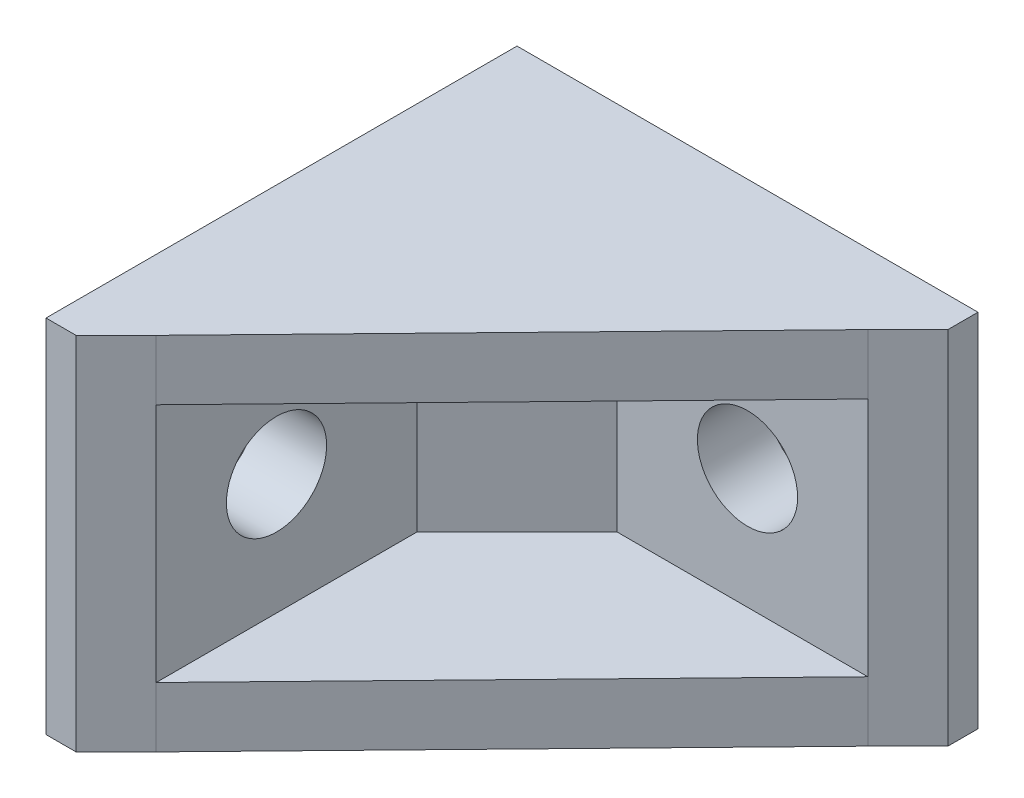
ISO-10303-21;
HEADER;
FILE_DESCRIPTION(('STEP AP214'),'2;1');
FILE_NAME('part.step','',(''),(''),'','','');
FILE_SCHEMA(('AUTOMOTIVE_DESIGN { 1 0 10303 214 1 1 1 1 }'));
ENDSEC;
DATA;
#1=APPLICATION_CONTEXT('core data for automotive mechanical design processes');
#2=APPLICATION_PROTOCOL_DEFINITION('international standard','automotive_design',2000,#1);
#3=PRODUCT_CONTEXT('',#1,'mechanical');
#4=PRODUCT('Part','Part','',(#3));
#5=PRODUCT_RELATED_PRODUCT_CATEGORY('part','',(#4));
#6=PRODUCT_DEFINITION_FORMATION('','',#4);
#7=PRODUCT_DEFINITION_CONTEXT('part definition',#1,'design');
#8=PRODUCT_DEFINITION('design','',#6,#7);
#9=PRODUCT_DEFINITION_SHAPE('','',#8);
#10=(LENGTH_UNIT() NAMED_UNIT(*) SI_UNIT(.MILLI.,.METRE.));
#11=(NAMED_UNIT(*) PLANE_ANGLE_UNIT() SI_UNIT($,.RADIAN.));
#12=(NAMED_UNIT(*) SI_UNIT($,.STERADIAN.) SOLID_ANGLE_UNIT());
#13=UNCERTAINTY_MEASURE_WITH_UNIT(LENGTH_MEASURE(1.E-05),#10,'distance_accuracy_value','');
#14=(GEOMETRIC_REPRESENTATION_CONTEXT(3) GLOBAL_UNCERTAINTY_ASSIGNED_CONTEXT((#13)) GLOBAL_UNIT_ASSIGNED_CONTEXT((#10,
#11,#12)) REPRESENTATION_CONTEXT('',''));
#15=CARTESIAN_POINT('',(0.,0.,0.));
#16=DIRECTION('',(0.,0.,1.));
#17=DIRECTION('',(1.,0.,0.));
#18=AXIS2_PLACEMENT_3D('',#15,#16,#17);
#19=CARTESIAN_POINT('',(0.,0.,3.5));
#20=DIRECTION('',(0.,0.,1.));
#21=DIRECTION('',(1.,0.,0.));
#22=AXIS2_PLACEMENT_3D('',#19,#20,#21);
#23=PLANE('',#22);
#24=CARTESIAN_POINT('',(4.33614349775784,5.76000000000001,3.5));
#25=DIRECTION('',(0.,0.,1.));
#26=DIRECTION('',(1.,0.,0.));
#27=AXIS2_PLACEMENT_3D('',#24,#25,#26);
#28=CIRCLE('',#27,2.5);
#29=CARTESIAN_POINT('',(6.83614349775784,5.76000000000001,3.5));
#30=VERTEX_POINT('',#29);
#31=EDGE_CURVE('E166',#30,#30,#28,.T.);
#32=ORIENTED_EDGE('',*,*,#31,.F.);
#33=EDGE_LOOP('',(#32));
#34=FACE_BOUND('',#33,.T.);
#35=DIRECTION('',(0.,-1.,0.));
#36=VECTOR('',#35,1.);
#37=CARTESIAN_POINT('',(-2.16385650224218,0.,3.5));
#38=LINE('',#37,#36);
#39=CARTESIAN_POINT('',(-2.16385650224218,11.76,3.5));
#40=VERTEX_POINT('',#39);
#41=CARTESIAN_POINT('',(-2.16385650224218,-0.239999999999996,3.5));
#42=VERTEX_POINT('',#41);
#43=EDGE_CURVE('E128',#40,#42,#38,.T.);
#44=ORIENTED_EDGE('',*,*,#43,.T.);
#45=DIRECTION('',(1.,0.,0.));
#46=VECTOR('',#45,1.);
#47=CARTESIAN_POINT('',(10.3361434977578,-0.239999999999996,3.5));
#48=LINE('',#47,#46);
#49=CARTESIAN_POINT('',(10.3361434977578,-0.239999999999996,3.5));
#50=VERTEX_POINT('',#49);
#51=EDGE_CURVE('E127',#42,#50,#48,.T.);
#52=ORIENTED_EDGE('',*,*,#51,.T.);
#53=DIRECTION('',(0.,1.,0.));
#54=VECTOR('',#53,1.);
#55=CARTESIAN_POINT('',(10.3361434977578,14.76,3.5));
#56=LINE('',#55,#54);
#57=CARTESIAN_POINT('',(10.3361434977578,11.76,3.5));
#58=VERTEX_POINT('',#57);
#59=EDGE_CURVE('E116',#50,#58,#56,.T.);
#60=ORIENTED_EDGE('',*,*,#59,.T.);
#61=DIRECTION('',(-1.,0.,0.));
#62=VECTOR('',#61,1.);
#63=CARTESIAN_POINT('',(-2.16385650224218,11.76,3.5));
#64=LINE('',#63,#62);
#65=EDGE_CURVE('E147',#58,#40,#64,.T.);
#66=ORIENTED_EDGE('',*,*,#65,.T.);
#67=EDGE_LOOP('',(#44,#52,#60,#66));
#68=FACE_BOUND('',#67,.T.);
#69=ADVANCED_FACE('F32',(#34,#68),#23,.T.);
#70=CARTESIAN_POINT('',(-7.16385650224216,-3.24,23.5));
#71=DIRECTION('',(-1.,0.,0.));
#72=DIRECTION('',(0.,-1.,0.));
#73=AXIS2_PLACEMENT_3D('',#70,#71,#72);
#74=PLANE('',#73);
#75=CARTESIAN_POINT('',(-7.16385650224216,5.76,15.5));
#76=DIRECTION('',(1.,0.,0.));
#77=DIRECTION('',(0.,1.,0.));
#78=AXIS2_PLACEMENT_3D('',#75,#76,#77);
#79=CIRCLE('',#78,2.5);
#80=CARTESIAN_POINT('',(-7.16385650224216,8.26,15.5));
#81=VERTEX_POINT('',#80);
#82=EDGE_CURVE('E160',#81,#81,#79,.T.);
#83=ORIENTED_EDGE('',*,*,#82,.F.);
#84=EDGE_LOOP('',(#83));
#85=FACE_BOUND('',#84,.T.);
#86=DIRECTION('',(0.,0.,-1.));
#87=VECTOR('',#86,1.);
#88=CARTESIAN_POINT('',(-7.16385650224216,-0.239999999999996,8.50000000000004));
#89=LINE('',#88,#87);
#90=CARTESIAN_POINT('',(-7.16385650224216,-0.239999999999996,21.5));
#91=VERTEX_POINT('',#90);
#92=CARTESIAN_POINT('',(-7.16385650224216,-0.239999999999996,8.50000000000004));
#93=VERTEX_POINT('',#92);
#94=EDGE_CURVE('E55',#91,#93,#89,.T.);
#95=ORIENTED_EDGE('',*,*,#94,.T.);
#96=DIRECTION('',(0.,1.,0.));
#97=VECTOR('',#96,1.);
#98=CARTESIAN_POINT('',(-7.16385650224216,-3.24,8.50000000000004));
#99=LINE('',#98,#97);
#100=CARTESIAN_POINT('',(-7.16385650224217,11.76,8.50000000000004));
#101=VERTEX_POINT('',#100);
#102=EDGE_CURVE('E199',#93,#101,#99,.T.);
#103=ORIENTED_EDGE('',*,*,#102,.T.);
#104=DIRECTION('',(0.,0.,1.));
#105=VECTOR('',#104,1.);
#106=CARTESIAN_POINT('',(-7.16385650224217,11.76,21.5));
#107=LINE('',#106,#105);
#108=CARTESIAN_POINT('',(-7.16385650224217,11.76,21.5));
#109=VERTEX_POINT('',#108);
#110=EDGE_CURVE('E152',#101,#109,#107,.T.);
#111=ORIENTED_EDGE('',*,*,#110,.T.);
#112=DIRECTION('',(0.,-1.,0.));
#113=VECTOR('',#112,1.);
#114=CARTESIAN_POINT('',(-7.16385650224216,-3.24,21.5));
#115=LINE('',#114,#113);
#116=EDGE_CURVE('E211',#109,#91,#115,.T.);
#117=ORIENTED_EDGE('',*,*,#116,.T.);
#118=EDGE_LOOP('',(#95,#103,#111,#117));
#119=FACE_BOUND('',#118,.T.);
#120=ADVANCED_FACE('F254',(#85,#119),#74,.F.);
#121=CARTESIAN_POINT('',(-7.16385650224216,-3.24,8.50000000000004));
#122=DIRECTION('',(-0.707106781186551,0.,-0.707106781186544));
#123=DIRECTION('',(0.,1.,0.));
#124=AXIS2_PLACEMENT_3D('',#121,#122,#123);
#125=PLANE('',#124);
#126=DIRECTION('',(0.707106781186544,0.,-0.707106781186551));
#127=VECTOR('',#126,1.);
#128=CARTESIAN_POINT('',(-2.16385650224217,-0.239999999999996,3.5));
#129=LINE('',#128,#127);
#130=EDGE_CURVE('E47',#93,#42,#129,.T.);
#131=ORIENTED_EDGE('',*,*,#130,.T.);
#132=ORIENTED_EDGE('',*,*,#43,.F.);
#133=DIRECTION('',(-0.707106781186544,0.,0.707106781186551));
#134=VECTOR('',#133,1.);
#135=CARTESIAN_POINT('',(-7.16385650224217,11.76,8.50000000000004));
#136=LINE('',#135,#134);
#137=EDGE_CURVE('E149',#40,#101,#136,.T.);
#138=ORIENTED_EDGE('',*,*,#137,.T.);
#139=ORIENTED_EDGE('',*,*,#102,.F.);
#140=EDGE_LOOP('',(#131,#132,#138,#139));
#141=FACE_BOUND('',#140,.T.);
#142=ADVANCED_FACE('F252',(#141),#125,.F.);
#143=CARTESIAN_POINT('',(-10.6638565022422,14.76,3.5));
#144=DIRECTION('',(1.,0.,0.));
#145=DIRECTION('',(0.,1.,0.));
#146=AXIS2_PLACEMENT_3D('',#143,#144,#145);
#147=PLANE('',#146);
#148=CARTESIAN_POINT('',(-10.6638565022422,5.76,15.5));
#149=DIRECTION('',(1.,0.,0.));
#150=DIRECTION('',(0.,1.,0.));
#151=AXIS2_PLACEMENT_3D('',#148,#149,#150);
#152=CIRCLE('',#151,2.5);
#153=CARTESIAN_POINT('',(-10.6638565022422,8.26,15.5));
#154=VERTEX_POINT('',#153);
#155=EDGE_CURVE('E163',#154,#154,#152,.T.);
#156=ORIENTED_EDGE('',*,*,#155,.T.);
#157=EDGE_LOOP('',(#156));
#158=FACE_BOUND('',#157,.T.);
#159=DIRECTION('',(0.,-1.,0.));
#160=VECTOR('',#159,1.);
#161=CARTESIAN_POINT('',(-10.6638565022422,14.76,0.));
#162=LINE('',#161,#160);
#163=CARTESIAN_POINT('',(-10.6638565022422,14.76,0.));
#164=VERTEX_POINT('',#163);
#165=CARTESIAN_POINT('',(-10.6638565022422,-3.24,0.));
#166=VERTEX_POINT('',#165);
#167=EDGE_CURVE('E178',#164,#166,#162,.T.);
#168=ORIENTED_EDGE('',*,*,#167,.T.);
#169=DIRECTION('',(0.,0.,-1.));
#170=VECTOR('',#169,1.);
#171=CARTESIAN_POINT('',(-10.6638565022422,-3.24,3.5));
#172=LINE('',#171,#170);
#173=CARTESIAN_POINT('',(-10.6638565022422,-3.24,23.5));
#174=VERTEX_POINT('',#173);
#175=EDGE_CURVE('E196',#174,#166,#172,.T.);
#176=ORIENTED_EDGE('',*,*,#175,.F.);
#177=DIRECTION('',(0.,-1.,0.));
#178=VECTOR('',#177,1.);
#179=CARTESIAN_POINT('',(-10.6638565022422,-3.24,23.5));
#180=LINE('',#179,#178);
#181=CARTESIAN_POINT('',(-10.6638565022422,14.76,23.5));
#182=VERTEX_POINT('',#181);
#183=EDGE_CURVE('E170',#182,#174,#180,.T.);
#184=ORIENTED_EDGE('',*,*,#183,.F.);
#185=DIRECTION('',(0.,0.,-1.));
#186=VECTOR('',#185,1.);
#187=CARTESIAN_POINT('',(-10.6638565022422,14.76,3.5));
#188=LINE('',#187,#186);
#189=EDGE_CURVE('E189',#182,#164,#188,.T.);
#190=ORIENTED_EDGE('',*,*,#189,.T.);
#191=EDGE_LOOP('',(#168,#176,#184,#190));
#192=FACE_BOUND('',#191,.T.);
#193=ADVANCED_FACE('F236',(#158,#192),#147,.F.);
#194=CARTESIAN_POINT('',(-10.6638565022422,-3.24,3.5));
#195=DIRECTION('',(0.,1.,0.));
#196=DIRECTION('',(0.,0.,1.));
#197=AXIS2_PLACEMENT_3D('',#194,#195,#196);
#198=PLANE('',#197);
#199=DIRECTION('',(-0.707106781186545,0.,0.70710678118655));
#200=VECTOR('',#199,1.);
#201=CARTESIAN_POINT('',(10.3361434977578,-3.24,3.5));
#202=LINE('',#201,#200);
#203=CARTESIAN_POINT('',(12.3361434977578,-3.24,1.49999999999999));
#204=VERTEX_POINT('',#203);
#205=CARTESIAN_POINT('',(10.3361434977578,-3.24,3.5));
#206=VERTEX_POINT('',#205);
#207=EDGE_CURVE('E215',#204,#206,#202,.T.);
#208=ORIENTED_EDGE('',*,*,#207,.T.);
#209=DIRECTION('',(-0.697078393291808,0.,0.71699491881443));
#210=VECTOR('',#209,1.);
#211=CARTESIAN_POINT('',(-7.16385650224216,-3.24,21.5));
#212=LINE('',#211,#210);
#213=CARTESIAN_POINT('',(-7.16385650224216,-3.24,21.5));
#214=VERTEX_POINT('',#213);
#215=EDGE_CURVE('E138',#206,#214,#212,.T.);
#216=ORIENTED_EDGE('',*,*,#215,.T.);
#217=DIRECTION('',(0.707106781186546,0.,-0.707106781186549));
#218=VECTOR('',#217,1.);
#219=CARTESIAN_POINT('',(-9.16385650224216,-3.24,23.5));
#220=LINE('',#219,#218);
#221=CARTESIAN_POINT('',(-9.16385650224216,-3.24,23.5));
#222=VERTEX_POINT('',#221);
#223=EDGE_CURVE('E125',#214,#222,#220,.F.);
#224=ORIENTED_EDGE('',*,*,#223,.T.);
#225=DIRECTION('',(1.,0.,0.));
#226=VECTOR('',#225,1.);
#227=CARTESIAN_POINT('',(-10.6638565022422,-3.24,23.5));
#228=LINE('',#227,#226);
#229=EDGE_CURVE('E173',#174,#222,#228,.T.);
#230=ORIENTED_EDGE('',*,*,#229,.F.);
#231=ORIENTED_EDGE('',*,*,#175,.T.);
#232=DIRECTION('',(1.,0.,0.));
#233=VECTOR('',#232,1.);
#234=CARTESIAN_POINT('',(-10.6638565022422,-3.24,0.));
#235=LINE('',#234,#233);
#236=CARTESIAN_POINT('',(12.3361434977578,-3.24,0.));
#237=VERTEX_POINT('',#236);
#238=EDGE_CURVE('E181',#166,#237,#235,.T.);
#239=ORIENTED_EDGE('',*,*,#238,.T.);
#240=DIRECTION('',(0.,0.,-1.));
#241=VECTOR('',#240,1.);
#242=CARTESIAN_POINT('',(12.3361434977578,-3.24,3.5));
#243=LINE('',#242,#241);
#244=EDGE_CURVE('E194',#204,#237,#243,.T.);
#245=ORIENTED_EDGE('',*,*,#244,.F.);
#246=EDGE_LOOP('',(#208,#216,#224,#230,#231,#239,#245));
#247=FACE_BOUND('',#246,.T.);
#248=ADVANCED_FACE('F219',(#247),#198,.F.);
#249=CARTESIAN_POINT('',(12.3361434977578,14.76,3.5));
#250=DIRECTION('',(-1.,0.,0.));
#251=DIRECTION('',(0.,-1.,0.));
#252=AXIS2_PLACEMENT_3D('',#249,#250,#251);
#253=PLANE('',#252);
#254=DIRECTION('',(0.,0.,-1.));
#255=VECTOR('',#254,1.);
#256=CARTESIAN_POINT('',(12.3361434977578,14.76,3.5));
#257=LINE('',#256,#255);
#258=CARTESIAN_POINT('',(12.3361434977578,14.76,1.49999999999999));
#259=VERTEX_POINT('',#258);
#260=CARTESIAN_POINT('',(12.3361434977578,14.76,0.));
#261=VERTEX_POINT('',#260);
#262=EDGE_CURVE('E192',#259,#261,#257,.T.);
#263=ORIENTED_EDGE('',*,*,#262,.F.);
#264=DIRECTION('',(0.,-1.,0.));
#265=VECTOR('',#264,1.);
#266=CARTESIAN_POINT('',(12.3361434977578,-3.24,1.49999999999999));
#267=LINE('',#266,#265);
#268=EDGE_CURVE('E11',#259,#204,#267,.T.);
#269=ORIENTED_EDGE('',*,*,#268,.T.);
#270=ORIENTED_EDGE('',*,*,#244,.T.);
#271=DIRECTION('',(0.,1.,0.));
#272=VECTOR('',#271,1.);
#273=CARTESIAN_POINT('',(12.3361434977578,14.76,0.));
#274=LINE('',#273,#272);
#275=EDGE_CURVE('E184',#237,#261,#274,.T.);
#276=ORIENTED_EDGE('',*,*,#275,.T.);
#277=EDGE_LOOP('',(#263,#269,#270,#276));
#278=FACE_BOUND('',#277,.T.);
#279=ADVANCED_FACE('F243',(#278),#253,.F.);
#280=CARTESIAN_POINT('',(-10.6638565022422,14.76,3.5));
#281=DIRECTION('',(0.,-1.,0.));
#282=DIRECTION('',(0.,0.,-1.));
#283=AXIS2_PLACEMENT_3D('',#280,#281,#282);
#284=PLANE('',#283);
#285=DIRECTION('',(-1.,0.,0.));
#286=VECTOR('',#285,1.);
#287=CARTESIAN_POINT('',(-10.6638565022422,14.76,23.5));
#288=LINE('',#287,#286);
#289=CARTESIAN_POINT('',(-9.16385650224217,14.76,23.5));
#290=VERTEX_POINT('',#289);
#291=EDGE_CURVE('E176',#290,#182,#288,.T.);
#292=ORIENTED_EDGE('',*,*,#291,.F.);
#293=DIRECTION('',(-0.707106781186546,0.,0.707106781186549));
#294=VECTOR('',#293,1.);
#295=CARTESIAN_POINT('',(-9.16385650224217,14.76,23.5));
#296=LINE('',#295,#294);
#297=CARTESIAN_POINT('',(-7.16385650224217,14.76,21.5));
#298=VERTEX_POINT('',#297);
#299=EDGE_CURVE('E209',#290,#298,#296,.F.);
#300=ORIENTED_EDGE('',*,*,#299,.T.);
#301=DIRECTION('',(0.697078393291808,0.,-0.71699491881443));
#302=VECTOR('',#301,1.);
#303=CARTESIAN_POINT('',(10.3361434977578,14.76,3.5));
#304=LINE('',#303,#302);
#305=CARTESIAN_POINT('',(10.3361434977578,14.76,3.5));
#306=VERTEX_POINT('',#305);
#307=EDGE_CURVE('E142',#298,#306,#304,.T.);
#308=ORIENTED_EDGE('',*,*,#307,.T.);
#309=DIRECTION('',(0.707106781186545,0.,-0.70710678118655));
#310=VECTOR('',#309,1.);
#311=CARTESIAN_POINT('',(10.3361434977578,14.76,3.5));
#312=LINE('',#311,#310);
#313=EDGE_CURVE('E207',#306,#259,#312,.T.);
#314=ORIENTED_EDGE('',*,*,#313,.T.);
#315=ORIENTED_EDGE('',*,*,#262,.T.);
#316=DIRECTION('',(-1.,0.,0.));
#317=VECTOR('',#316,1.);
#318=CARTESIAN_POINT('',(-10.6638565022422,14.76,0.));
#319=LINE('',#318,#317);
#320=EDGE_CURVE('E187',#261,#164,#319,.T.);
#321=ORIENTED_EDGE('',*,*,#320,.T.);
#322=ORIENTED_EDGE('',*,*,#189,.F.);
#323=EDGE_LOOP('',(#292,#300,#308,#314,#315,#321,#322));
#324=FACE_BOUND('',#323,.T.);
#325=ADVANCED_FACE('F231',(#324),#284,.F.);
#326=CARTESIAN_POINT('',(0.,0.,0.));
#327=DIRECTION('',(0.,0.,1.));
#328=DIRECTION('',(1.,0.,0.));
#329=AXIS2_PLACEMENT_3D('',#326,#327,#328);
#330=PLANE('',#329);
#331=CARTESIAN_POINT('',(4.33614349775784,5.76000000000001,0.));
#332=DIRECTION('',(0.,0.,1.));
#333=DIRECTION('',(1.,0.,0.));
#334=AXIS2_PLACEMENT_3D('',#331,#332,#333);
#335=CIRCLE('',#334,2.5);
#336=CARTESIAN_POINT('',(6.83614349775784,5.76000000000001,0.));
#337=VERTEX_POINT('',#336);
#338=EDGE_CURVE('E169',#337,#337,#335,.T.);
#339=ORIENTED_EDGE('',*,*,#338,.T.);
#340=EDGE_LOOP('',(#339));
#341=FACE_BOUND('',#340,.T.);
#342=ORIENTED_EDGE('',*,*,#167,.F.);
#343=ORIENTED_EDGE('',*,*,#320,.F.);
#344=ORIENTED_EDGE('',*,*,#275,.F.);
#345=ORIENTED_EDGE('',*,*,#238,.F.);
#346=EDGE_LOOP('',(#342,#343,#344,#345));
#347=FACE_BOUND('',#346,.T.);
#348=ADVANCED_FACE('F240',(#341,#347),#330,.F.);
#349=CARTESIAN_POINT('',(0.,0.,23.5));
#350=DIRECTION('',(0.,0.,-1.));
#351=DIRECTION('',(-1.,0.,0.));
#352=AXIS2_PLACEMENT_3D('',#349,#350,#351);
#353=PLANE('',#352);
#354=ORIENTED_EDGE('',*,*,#229,.T.);
#355=DIRECTION('',(0.,1.,0.));
#356=VECTOR('',#355,1.);
#357=CARTESIAN_POINT('',(-9.16385650224216,0.,23.5));
#358=LINE('',#357,#356);
#359=EDGE_CURVE('E204',#222,#290,#358,.T.);
#360=ORIENTED_EDGE('',*,*,#359,.T.);
#361=ORIENTED_EDGE('',*,*,#291,.T.);
#362=ORIENTED_EDGE('',*,*,#183,.T.);
#363=EDGE_LOOP('',(#354,#360,#361,#362));
#364=FACE_BOUND('',#363,.T.);
#365=ADVANCED_FACE('F223',(#364),#353,.F.);
#366=CARTESIAN_POINT('',(4.33614349775784,5.76000000000001,-16.5));
#367=DIRECTION('',(0.,0.,1.));
#368=DIRECTION('',(1.,0.,0.));
#369=AXIS2_PLACEMENT_3D('',#366,#367,#368);
#370=CYLINDRICAL_SURFACE('',#369,2.5);
#371=ORIENTED_EDGE('',*,*,#31,.T.);
#372=EDGE_LOOP('',(#371));
#373=FACE_BOUND('',#372,.T.);
#374=ORIENTED_EDGE('',*,*,#338,.F.);
#375=EDGE_LOOP('',(#374));
#376=FACE_BOUND('',#375,.T.);
#377=ADVANCED_FACE('F286',(#373,#376),#370,.F.);
#378=CARTESIAN_POINT('',(-27.1638565022422,5.76,15.5));
#379=DIRECTION('',(1.,0.,0.));
#380=DIRECTION('',(0.,1.,0.));
#381=AXIS2_PLACEMENT_3D('',#378,#379,#380);
#382=CYLINDRICAL_SURFACE('',#381,2.5);
#383=ORIENTED_EDGE('',*,*,#82,.T.);
#384=EDGE_LOOP('',(#383));
#385=FACE_BOUND('',#384,.T.);
#386=ORIENTED_EDGE('',*,*,#155,.F.);
#387=EDGE_LOOP('',(#386));
#388=FACE_BOUND('',#387,.T.);
#389=ADVANCED_FACE('F281',(#385,#388),#382,.F.);
#390=CARTESIAN_POINT('',(-9.16385650224216,0.,23.5));
#391=DIRECTION('',(-0.707106781186549,0.,-0.707106781186546));
#392=DIRECTION('',(0.,1.,0.));
#393=AXIS2_PLACEMENT_3D('',#390,#391,#392);
#394=PLANE('',#393);
#395=ORIENTED_EDGE('',*,*,#223,.F.);
#396=DIRECTION('',(0.,-1.,0.));
#397=VECTOR('',#396,1.);
#398=CARTESIAN_POINT('',(-7.16385650224216,-0.239999999999996,21.5));
#399=LINE('',#398,#397);
#400=EDGE_CURVE('E140',#91,#214,#399,.T.);
#401=ORIENTED_EDGE('',*,*,#400,.F.);
#402=ORIENTED_EDGE('',*,*,#116,.F.);
#403=EDGE_CURVE('E212',#298,#109,#115,.T.);
#404=ORIENTED_EDGE('',*,*,#403,.F.);
#405=ORIENTED_EDGE('',*,*,#299,.F.);
#406=ORIENTED_EDGE('',*,*,#359,.F.);
#407=EDGE_LOOP('',(#395,#401,#402,#404,#405,#406));
#408=FACE_BOUND('',#407,.T.);
#409=ADVANCED_FACE('F226',(#408),#394,.F.);
#410=CARTESIAN_POINT('',(10.3361434977578,0.,3.5));
#411=DIRECTION('',(0.70710678118655,0.,0.707106781186545));
#412=DIRECTION('',(0.,-1.,0.));
#413=AXIS2_PLACEMENT_3D('',#410,#411,#412);
#414=PLANE('',#413);
#415=ORIENTED_EDGE('',*,*,#207,.F.);
#416=ORIENTED_EDGE('',*,*,#268,.F.);
#417=ORIENTED_EDGE('',*,*,#313,.F.);
#418=DIRECTION('',(0.,1.,0.));
#419=VECTOR('',#418,1.);
#420=CARTESIAN_POINT('',(10.3361434977578,11.76,3.5));
#421=LINE('',#420,#419);
#422=EDGE_CURVE('E122',#58,#306,#421,.T.);
#423=ORIENTED_EDGE('',*,*,#422,.F.);
#424=ORIENTED_EDGE('',*,*,#59,.F.);
#425=EDGE_CURVE('E40',#206,#50,#56,.T.);
#426=ORIENTED_EDGE('',*,*,#425,.F.);
#427=EDGE_LOOP('',(#415,#416,#417,#423,#424,#426));
#428=FACE_BOUND('',#427,.T.);
#429=ADVANCED_FACE('F34',(#428),#414,.T.);
#430=CARTESIAN_POINT('',(10.3361434977578,11.76,3.5));
#431=DIRECTION('',(0.71699491881443,0.,0.697078393291808));
#432=DIRECTION('',(0.697078393291808,0.,-0.71699491881443));
#433=AXIS2_PLACEMENT_3D('',#430,#431,#432);
#434=PLANE('',#433);
#435=ORIENTED_EDGE('',*,*,#307,.F.);
#436=ORIENTED_EDGE('',*,*,#403,.T.);
#437=DIRECTION('',(0.697078393291808,0.,-0.71699491881443));
#438=VECTOR('',#437,1.);
#439=CARTESIAN_POINT('',(10.3361434977578,11.76,3.5));
#440=LINE('',#439,#438);
#441=EDGE_CURVE('E154',#109,#58,#440,.T.);
#442=ORIENTED_EDGE('',*,*,#441,.T.);
#443=ORIENTED_EDGE('',*,*,#422,.T.);
#444=EDGE_LOOP('',(#435,#436,#442,#443));
#445=FACE_BOUND('',#444,.T.);
#446=ADVANCED_FACE('F246',(#445),#434,.T.);
#447=CARTESIAN_POINT('',(0.,11.76,0.));
#448=DIRECTION('',(0.,1.,0.));
#449=DIRECTION('',(0.,0.,1.));
#450=AXIS2_PLACEMENT_3D('',#447,#448,#449);
#451=PLANE('',#450);
#452=ORIENTED_EDGE('',*,*,#65,.F.);
#453=ORIENTED_EDGE('',*,*,#441,.F.);
#454=ORIENTED_EDGE('',*,*,#110,.F.);
#455=ORIENTED_EDGE('',*,*,#137,.F.);
#456=EDGE_LOOP('',(#452,#453,#454,#455));
#457=FACE_BOUND('',#456,.T.);
#458=ADVANCED_FACE('F250',(#457),#451,.F.);
#459=CARTESIAN_POINT('',(-7.16385650224216,-0.239999999999996,21.5));
#460=DIRECTION('',(0.71699491881443,0.,0.697078393291808));
#461=DIRECTION('',(0.697078393291808,0.,-0.71699491881443));
#462=AXIS2_PLACEMENT_3D('',#459,#460,#461);
#463=PLANE('',#462);
#464=ORIENTED_EDGE('',*,*,#215,.F.);
#465=ORIENTED_EDGE('',*,*,#425,.T.);
#466=DIRECTION('',(-0.697078393291808,0.,0.71699491881443));
#467=VECTOR('',#466,1.);
#468=CARTESIAN_POINT('',(-7.16385650224216,-0.239999999999996,21.5));
#469=LINE('',#468,#467);
#470=EDGE_CURVE('E131',#50,#91,#469,.T.);
#471=ORIENTED_EDGE('',*,*,#470,.T.);
#472=ORIENTED_EDGE('',*,*,#400,.T.);
#473=EDGE_LOOP('',(#464,#465,#471,#472));
#474=FACE_BOUND('',#473,.T.);
#475=ADVANCED_FACE('F135',(#474),#463,.T.);
#476=CARTESIAN_POINT('',(0.,-0.239999999999996,0.));
#477=DIRECTION('',(0.,-1.,0.));
#478=DIRECTION('',(0.,0.,-1.));
#479=AXIS2_PLACEMENT_3D('',#476,#477,#478);
#480=PLANE('',#479);
#481=ORIENTED_EDGE('',*,*,#94,.F.);
#482=ORIENTED_EDGE('',*,*,#470,.F.);
#483=ORIENTED_EDGE('',*,*,#51,.F.);
#484=ORIENTED_EDGE('',*,*,#130,.F.);
#485=EDGE_LOOP('',(#481,#482,#483,#484));
#486=FACE_BOUND('',#485,.T.);
#487=ADVANCED_FACE('F139',(#486),#480,.F.);
#488=CLOSED_SHELL('',(#69,#120,#142,#193,#248,#279,#325,#348,#365,#377,#389,#409,#429,#446,#458,
#475,#487));
#489=MANIFOLD_SOLID_BREP('B2',#488);
#490=ADVANCED_BREP_SHAPE_REPRESENTATION('',(#18,#489),#14);
#491=SHAPE_DEFINITION_REPRESENTATION(#9,#490);
ENDSEC;
END-ISO-10303-21;
